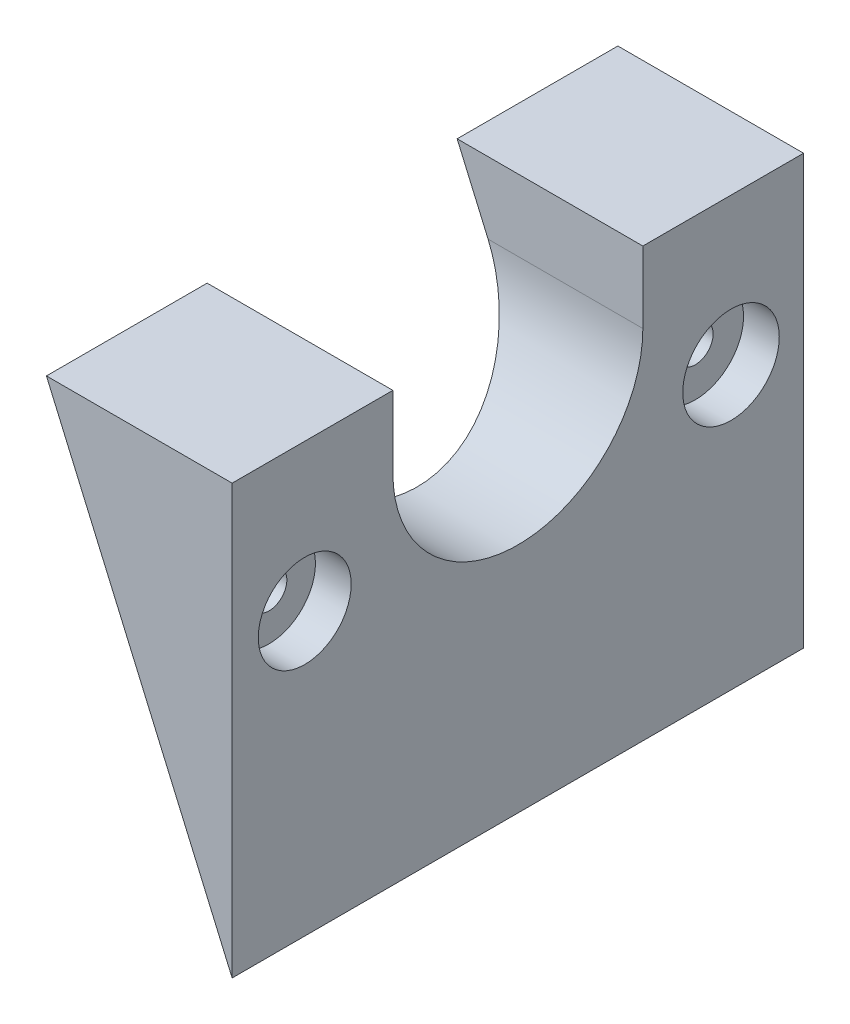
ISO-10303-21;
HEADER;
FILE_DESCRIPTION(('STEP AP214'),'2;1');
FILE_NAME('part.step','',(''),(''),'','','');
FILE_SCHEMA(('AUTOMOTIVE_DESIGN { 1 0 10303 214 1 1 1 1 }'));
ENDSEC;
DATA;
#1=APPLICATION_CONTEXT('core data for automotive mechanical design processes');
#2=APPLICATION_PROTOCOL_DEFINITION('international standard','automotive_design',2000,#1);
#3=PRODUCT_CONTEXT('',#1,'mechanical');
#4=PRODUCT('Part','Part','',(#3));
#5=PRODUCT_RELATED_PRODUCT_CATEGORY('part','',(#4));
#6=PRODUCT_DEFINITION_FORMATION('','',#4);
#7=PRODUCT_DEFINITION_CONTEXT('part definition',#1,'design');
#8=PRODUCT_DEFINITION('design','',#6,#7);
#9=PRODUCT_DEFINITION_SHAPE('','',#8);
#10=(LENGTH_UNIT() NAMED_UNIT(*) SI_UNIT(.MILLI.,.METRE.));
#11=(NAMED_UNIT(*) PLANE_ANGLE_UNIT() SI_UNIT($,.RADIAN.));
#12=(NAMED_UNIT(*) SI_UNIT($,.STERADIAN.) SOLID_ANGLE_UNIT());
#13=UNCERTAINTY_MEASURE_WITH_UNIT(LENGTH_MEASURE(1.E-05),#10,'distance_accuracy_value','');
#14=(GEOMETRIC_REPRESENTATION_CONTEXT(3) GLOBAL_UNCERTAINTY_ASSIGNED_CONTEXT((#13)) GLOBAL_UNIT_ASSIGNED_CONTEXT((#10,
#11,#12)) REPRESENTATION_CONTEXT('',''));
#15=CARTESIAN_POINT('',(0.,0.,0.));
#16=DIRECTION('',(0.,0.,1.));
#17=DIRECTION('',(1.,0.,0.));
#18=AXIS2_PLACEMENT_3D('',#15,#16,#17);
#19=CARTESIAN_POINT('',(-80.,39.4294929719621,10.1582088850458));
#20=DIRECTION('',(1.,0.,0.));
#21=DIRECTION('',(0.,0.,-1.));
#22=AXIS2_PLACEMENT_3D('',#19,#20,#21);
#23=CYLINDRICAL_SURFACE('',#22,2.5);
#24=CARTESIAN_POINT('',(-17.0861136211836,39.4294929719621,10.1582088850458));
#25=DIRECTION('',(0.917555625309924,0.397607437634301,0.));
#26=DIRECTION('',(0.3976074376343,-0.917555625309924,0.));
#27=AXIS2_PLACEMENT_3D('',#24,#25,#26);
#28=ELLIPSE('',#27,2.7246304540453,2.5);
#29=CARTESIAN_POINT('',(-16.0027802878502,36.9294929719621,10.1582088850458));
#30=VERTEX_POINT('',#29);
#31=EDGE_CURVE('E131',#30,#30,#28,.T.);
#32=ORIENTED_EDGE('',*,*,#31,.F.);
#33=EDGE_LOOP('',(#32));
#34=FACE_BOUND('',#33,.T.);
#35=CARTESIAN_POINT('',(-5.,39.4294929719621,10.1582088850458));
#36=DIRECTION('',(1.,0.,0.));
#37=DIRECTION('',(0.,0.,-1.));
#38=AXIS2_PLACEMENT_3D('',#35,#36,#37);
#39=CIRCLE('',#38,2.5);
#40=CARTESIAN_POINT('',(-5.,39.4294929719621,7.65820888504579));
#41=VERTEX_POINT('',#40);
#42=EDGE_CURVE('E37',#41,#41,#39,.F.);
#43=ORIENTED_EDGE('',*,*,#42,.F.);
#44=EDGE_LOOP('',(#43));
#45=FACE_BOUND('',#44,.T.);
#46=ADVANCED_FACE('F33',(#34,#45),#23,.F.);
#47=CARTESIAN_POINT('',(-80.,39.4294929719621,69.8417911149542));
#48=DIRECTION('',(1.,0.,0.));
#49=DIRECTION('',(0.,0.,-1.));
#50=AXIS2_PLACEMENT_3D('',#47,#48,#49);
#51=CYLINDRICAL_SURFACE('',#50,2.5);
#52=CARTESIAN_POINT('',(-17.0861136211836,39.4294929719621,69.8417911149542));
#53=DIRECTION('',(0.917555625309924,0.397607437634301,0.));
#54=DIRECTION('',(0.3976074376343,-0.917555625309924,0.));
#55=AXIS2_PLACEMENT_3D('',#52,#53,#54);
#56=ELLIPSE('',#55,2.7246304540453,2.5);
#57=CARTESIAN_POINT('',(-16.0027802878502,36.9294929719621,69.8417911149542));
#58=VERTEX_POINT('',#57);
#59=EDGE_CURVE('E136',#58,#58,#56,.T.);
#60=ORIENTED_EDGE('',*,*,#59,.F.);
#61=EDGE_LOOP('',(#60));
#62=FACE_BOUND('',#61,.T.);
#63=CARTESIAN_POINT('',(-5.,39.4294929719621,69.8417911149542));
#64=DIRECTION('',(1.,0.,0.));
#65=DIRECTION('',(0.,0.,-1.));
#66=AXIS2_PLACEMENT_3D('',#63,#64,#65);
#67=CIRCLE('',#66,2.5);
#68=CARTESIAN_POINT('',(-5.,39.4294929719621,67.3417911149542));
#69=VERTEX_POINT('',#68);
#70=EDGE_CURVE('E129',#69,#69,#67,.F.);
#71=ORIENTED_EDGE('',*,*,#70,.F.);
#72=EDGE_LOOP('',(#71));
#73=FACE_BOUND('',#72,.T.);
#74=ADVANCED_FACE('F196',(#62,#73),#51,.F.);
#75=CARTESIAN_POINT('',(0.,60.,80.));
#76=DIRECTION('',(0.,-1.,0.));
#77=DIRECTION('',(1.,0.,0.));
#78=AXIS2_PLACEMENT_3D('',#75,#76,#77);
#79=PLANE('',#78);
#80=DIRECTION('',(0.,0.,-1.));
#81=VECTOR('',#80,1.);
#82=CARTESIAN_POINT('',(0.,60.,80.));
#83=LINE('',#82,#81);
#84=CARTESIAN_POINT('',(0.,60.,80.));
#85=VERTEX_POINT('',#84);
#86=CARTESIAN_POINT('',(0.,60.,57.5));
#87=VERTEX_POINT('',#86);
#88=EDGE_CURVE('E42',#85,#87,#83,.T.);
#89=ORIENTED_EDGE('',*,*,#88,.T.);
#90=DIRECTION('',(1.,0.,0.));
#91=VECTOR('',#90,1.);
#92=CARTESIAN_POINT('',(-26.,60.,57.5));
#93=LINE('',#92,#91);
#94=CARTESIAN_POINT('',(-26.,60.,57.5));
#95=VERTEX_POINT('',#94);
#96=EDGE_CURVE('E107',#95,#87,#93,.T.);
#97=ORIENTED_EDGE('',*,*,#96,.F.);
#98=DIRECTION('',(0.,0.,-1.));
#99=VECTOR('',#98,1.);
#100=CARTESIAN_POINT('',(-26.,60.,80.));
#101=LINE('',#100,#99);
#102=CARTESIAN_POINT('',(-26.,60.,80.));
#103=VERTEX_POINT('',#102);
#104=EDGE_CURVE('E121',#103,#95,#101,.T.);
#105=ORIENTED_EDGE('',*,*,#104,.F.);
#106=DIRECTION('',(-1.,0.,0.));
#107=VECTOR('',#106,1.);
#108=CARTESIAN_POINT('',(0.,60.,80.));
#109=LINE('',#108,#107);
#110=EDGE_CURVE('E59',#85,#103,#109,.T.);
#111=ORIENTED_EDGE('',*,*,#110,.F.);
#112=EDGE_LOOP('',(#89,#97,#105,#111));
#113=FACE_BOUND('',#112,.T.);
#114=ADVANCED_FACE('F179',(#113),#79,.F.);
#115=CARTESIAN_POINT('',(-26.,60.,80.));
#116=DIRECTION('',(0.917555625309924,0.397607437634301,0.));
#117=DIRECTION('',(-0.3976074376343,0.917555625309924,0.));
#118=AXIS2_PLACEMENT_3D('',#115,#116,#117);
#119=PLANE('',#118);
#120=ORIENTED_EDGE('',*,*,#31,.T.);
#121=EDGE_LOOP('',(#120));
#122=FACE_BOUND('',#121,.T.);
#123=ORIENTED_EDGE('',*,*,#59,.T.);
#124=EDGE_LOOP('',(#123));
#125=FACE_BOUND('',#124,.T.);
#126=ORIENTED_EDGE('',*,*,#104,.T.);
#127=DIRECTION('',(0.3976074376343,-0.917555625309924,0.));
#128=VECTOR('',#127,1.);
#129=CARTESIAN_POINT('',(-26.,60.,57.5));
#130=LINE('',#129,#128);
#131=CARTESIAN_POINT('',(-21.6666666666667,50.,57.5));
#132=VERTEX_POINT('',#131);
#133=EDGE_CURVE('E114',#95,#132,#130,.T.);
#134=ORIENTED_EDGE('',*,*,#133,.T.);
#135=CARTESIAN_POINT('',(-21.6666666666667,50.,40.));
#136=DIRECTION('',(0.917555625309924,0.397607437634301,0.));
#137=DIRECTION('',(0.3976074376343,-0.917555625309924,0.));
#138=AXIS2_PLACEMENT_3D('',#135,#136,#137);
#139=ELLIPSE('',#138,19.0724131783171,17.5);
#140=CARTESIAN_POINT('',(-21.6666666666667,50.,22.5));
#141=VERTEX_POINT('',#140);
#142=EDGE_CURVE('E113',#132,#141,#139,.T.);
#143=ORIENTED_EDGE('',*,*,#142,.T.);
#144=DIRECTION('',(-0.3976074376343,0.917555625309924,0.));
#145=VECTOR('',#144,1.);
#146=CARTESIAN_POINT('',(-26.,60.,22.5));
#147=LINE('',#146,#145);
#148=CARTESIAN_POINT('',(-26.,60.,22.5));
#149=VERTEX_POINT('',#148);
#150=EDGE_CURVE('E103',#141,#149,#147,.T.);
#151=ORIENTED_EDGE('',*,*,#150,.T.);
#152=CARTESIAN_POINT('',(-26.,60.,0.));
#153=VERTEX_POINT('',#152);
#154=EDGE_CURVE('E77',#149,#153,#101,.T.);
#155=ORIENTED_EDGE('',*,*,#154,.T.);
#156=DIRECTION('',(0.397607437634301,-0.917555625309924,0.));
#157=VECTOR('',#156,1.);
#158=CARTESIAN_POINT('',(-26.,60.,0.));
#159=LINE('',#158,#157);
#160=CARTESIAN_POINT('',(0.,0.,0.));
#161=VERTEX_POINT('',#160);
#162=EDGE_CURVE('E163',#153,#161,#159,.T.);
#163=ORIENTED_EDGE('',*,*,#162,.T.);
#164=DIRECTION('',(0.,0.,-1.));
#165=VECTOR('',#164,1.);
#166=CARTESIAN_POINT('',(0.,0.,80.));
#167=LINE('',#166,#165);
#168=CARTESIAN_POINT('',(0.,0.,80.));
#169=VERTEX_POINT('',#168);
#170=EDGE_CURVE('E11',#169,#161,#167,.T.);
#171=ORIENTED_EDGE('',*,*,#170,.F.);
#172=DIRECTION('',(0.397607437634301,-0.917555625309924,0.));
#173=VECTOR('',#172,1.);
#174=CARTESIAN_POINT('',(-26.,60.,80.));
#175=LINE('',#174,#173);
#176=EDGE_CURVE('E164',#103,#169,#175,.T.);
#177=ORIENTED_EDGE('',*,*,#176,.F.);
#178=EDGE_LOOP('',(#126,#134,#143,#151,#155,#163,#171,#177));
#179=FACE_BOUND('',#178,.T.);
#180=ADVANCED_FACE('F35',(#122,#125,#179),#119,.F.);
#181=CARTESIAN_POINT('',(0.,0.,80.));
#182=DIRECTION('',(-1.,0.,0.));
#183=DIRECTION('',(0.,0.,1.));
#184=AXIS2_PLACEMENT_3D('',#181,#182,#183);
#185=PLANE('',#184);
#186=CARTESIAN_POINT('',(0.,39.4294929719621,10.1582088850458));
#187=DIRECTION('',(1.,0.,0.));
#188=DIRECTION('',(0.,0.,-1.));
#189=AXIS2_PLACEMENT_3D('',#186,#187,#188);
#190=CIRCLE('',#189,6.75580610171235);
#191=CARTESIAN_POINT('',(0.,39.4294929719621,3.40240278333344));
#192=VERTEX_POINT('',#191);
#193=EDGE_CURVE('E146',#192,#192,#190,.T.);
#194=ORIENTED_EDGE('',*,*,#193,.F.);
#195=EDGE_LOOP('',(#194));
#196=FACE_BOUND('',#195,.T.);
#197=CARTESIAN_POINT('',(0.,39.4294929719621,69.8417911149542));
#198=DIRECTION('',(1.,0.,0.));
#199=DIRECTION('',(0.,0.,-1.));
#200=AXIS2_PLACEMENT_3D('',#197,#198,#199);
#201=CIRCLE('',#200,6.50511993876965);
#202=CARTESIAN_POINT('',(0.,39.4294929719621,63.3366711761846));
#203=VERTEX_POINT('',#202);
#204=EDGE_CURVE('E139',#203,#203,#201,.T.);
#205=ORIENTED_EDGE('',*,*,#204,.F.);
#206=EDGE_LOOP('',(#205));
#207=FACE_BOUND('',#206,.T.);
#208=CARTESIAN_POINT('',(0.,50.,40.));
#209=DIRECTION('',(1.,0.,0.));
#210=DIRECTION('',(0.,0.,1.));
#211=AXIS2_PLACEMENT_3D('',#208,#209,#210);
#212=CIRCLE('',#211,17.5);
#213=CARTESIAN_POINT('',(0.,50.,57.5));
#214=VERTEX_POINT('',#213);
#215=CARTESIAN_POINT('',(0.,50.,22.5));
#216=VERTEX_POINT('',#215);
#217=EDGE_CURVE('E151',#214,#216,#212,.T.);
#218=ORIENTED_EDGE('',*,*,#217,.F.);
#219=DIRECTION('',(0.,-1.,0.));
#220=VECTOR('',#219,1.);
#221=CARTESIAN_POINT('',(0.,50.,57.5));
#222=LINE('',#221,#220);
#223=EDGE_CURVE('E155',#87,#214,#222,.T.);
#224=ORIENTED_EDGE('',*,*,#223,.F.);
#225=ORIENTED_EDGE('',*,*,#88,.F.);
#226=DIRECTION('',(0.,1.,0.));
#227=VECTOR('',#226,1.);
#228=CARTESIAN_POINT('',(0.,0.,80.));
#229=LINE('',#228,#227);
#230=EDGE_CURVE('E82',#169,#85,#229,.T.);
#231=ORIENTED_EDGE('',*,*,#230,.F.);
#232=ORIENTED_EDGE('',*,*,#170,.T.);
#233=DIRECTION('',(0.,1.,0.));
#234=VECTOR('',#233,1.);
#235=CARTESIAN_POINT('',(0.,0.,0.));
#236=LINE('',#235,#234);
#237=CARTESIAN_POINT('',(0.,60.,0.));
#238=VERTEX_POINT('',#237);
#239=EDGE_CURVE('E167',#161,#238,#236,.T.);
#240=ORIENTED_EDGE('',*,*,#239,.T.);
#241=CARTESIAN_POINT('',(0.,60.,22.5));
#242=VERTEX_POINT('',#241);
#243=EDGE_CURVE('E123',#242,#238,#83,.T.);
#244=ORIENTED_EDGE('',*,*,#243,.F.);
#245=DIRECTION('',(0.,1.,0.));
#246=VECTOR('',#245,1.);
#247=CARTESIAN_POINT('',(0.,60.,22.5));
#248=LINE('',#247,#246);
#249=EDGE_CURVE('E50',#216,#242,#248,.T.);
#250=ORIENTED_EDGE('',*,*,#249,.F.);
#251=EDGE_LOOP('',(#218,#224,#225,#231,#232,#240,#244,#250));
#252=FACE_BOUND('',#251,.T.);
#253=ADVANCED_FACE('F170',(#196,#207,#252),#185,.F.);
#254=ORIENTED_EDGE('',*,*,#154,.F.);
#255=DIRECTION('',(1.,0.,0.));
#256=VECTOR('',#255,1.);
#257=CARTESIAN_POINT('',(-26.,60.,22.5));
#258=LINE('',#257,#256);
#259=EDGE_CURVE('E101',#149,#242,#258,.T.);
#260=ORIENTED_EDGE('',*,*,#259,.T.);
#261=ORIENTED_EDGE('',*,*,#243,.T.);
#262=DIRECTION('',(-1.,0.,0.));
#263=VECTOR('',#262,1.);
#264=CARTESIAN_POINT('',(0.,60.,0.));
#265=LINE('',#264,#263);
#266=EDGE_CURVE('E119',#238,#153,#265,.T.);
#267=ORIENTED_EDGE('',*,*,#266,.T.);
#268=EDGE_LOOP('',(#254,#260,#261,#267));
#269=FACE_BOUND('',#268,.T.);
#270=ADVANCED_FACE('F117',(#269),#79,.F.);
#271=CARTESIAN_POINT('',(0.,0.,80.));
#272=DIRECTION('',(0.,0.,-1.));
#273=DIRECTION('',(-1.,0.,0.));
#274=AXIS2_PLACEMENT_3D('',#271,#272,#273);
#275=PLANE('',#274);
#276=ORIENTED_EDGE('',*,*,#176,.T.);
#277=ORIENTED_EDGE('',*,*,#230,.T.);
#278=ORIENTED_EDGE('',*,*,#110,.T.);
#279=EDGE_LOOP('',(#276,#277,#278));
#280=FACE_BOUND('',#279,.T.);
#281=ADVANCED_FACE('F175',(#280),#275,.F.);
#282=CARTESIAN_POINT('',(0.,0.,0.));
#283=DIRECTION('',(0.,0.,-1.));
#284=DIRECTION('',(-1.,0.,0.));
#285=AXIS2_PLACEMENT_3D('',#282,#283,#284);
#286=PLANE('',#285);
#287=ORIENTED_EDGE('',*,*,#162,.F.);
#288=ORIENTED_EDGE('',*,*,#266,.F.);
#289=ORIENTED_EDGE('',*,*,#239,.F.);
#290=EDGE_LOOP('',(#287,#288,#289));
#291=FACE_BOUND('',#290,.T.);
#292=ADVANCED_FACE('F173',(#291),#286,.T.);
#293=CARTESIAN_POINT('',(-26.,50.,40.));
#294=DIRECTION('',(1.,0.,0.));
#295=DIRECTION('',(0.,0.,-1.));
#296=AXIS2_PLACEMENT_3D('',#293,#294,#295);
#297=CYLINDRICAL_SURFACE('',#296,17.5);
#298=DIRECTION('',(1.,0.,0.));
#299=VECTOR('',#298,1.);
#300=CARTESIAN_POINT('',(-26.,50.,57.5));
#301=LINE('',#300,#299);
#302=EDGE_CURVE('E115',#132,#214,#301,.T.);
#303=ORIENTED_EDGE('',*,*,#302,.T.);
#304=ORIENTED_EDGE('',*,*,#217,.T.);
#305=DIRECTION('',(1.,0.,0.));
#306=VECTOR('',#305,1.);
#307=CARTESIAN_POINT('',(-26.,50.,22.5));
#308=LINE('',#307,#306);
#309=EDGE_CURVE('E108',#141,#216,#308,.T.);
#310=ORIENTED_EDGE('',*,*,#309,.F.);
#311=ORIENTED_EDGE('',*,*,#142,.F.);
#312=EDGE_LOOP('',(#303,#304,#310,#311));
#313=FACE_BOUND('',#312,.T.);
#314=ADVANCED_FACE('F184',(#313),#297,.F.);
#315=CARTESIAN_POINT('',(-26.,50.,57.5));
#316=DIRECTION('',(0.,0.,1.));
#317=DIRECTION('',(1.,0.,0.));
#318=AXIS2_PLACEMENT_3D('',#315,#316,#317);
#319=PLANE('',#318);
#320=ORIENTED_EDGE('',*,*,#96,.T.);
#321=ORIENTED_EDGE('',*,*,#223,.T.);
#322=ORIENTED_EDGE('',*,*,#302,.F.);
#323=ORIENTED_EDGE('',*,*,#133,.F.);
#324=EDGE_LOOP('',(#320,#321,#322,#323));
#325=FACE_BOUND('',#324,.T.);
#326=ADVANCED_FACE('F181',(#325),#319,.F.);
#327=CARTESIAN_POINT('',(-26.,60.,22.5));
#328=DIRECTION('',(0.,0.,-1.));
#329=DIRECTION('',(0.,1.,0.));
#330=AXIS2_PLACEMENT_3D('',#327,#328,#329);
#331=PLANE('',#330);
#332=ORIENTED_EDGE('',*,*,#309,.T.);
#333=ORIENTED_EDGE('',*,*,#249,.T.);
#334=ORIENTED_EDGE('',*,*,#259,.F.);
#335=ORIENTED_EDGE('',*,*,#150,.F.);
#336=EDGE_LOOP('',(#332,#333,#334,#335));
#337=FACE_BOUND('',#336,.T.);
#338=ADVANCED_FACE('F102',(#337),#331,.F.);
#339=CARTESIAN_POINT('',(-5.,39.4294929719621,69.8417911149542));
#340=DIRECTION('',(1.,0.,0.));
#341=DIRECTION('',(0.,0.,-1.));
#342=AXIS2_PLACEMENT_3D('',#339,#340,#341);
#343=PLANE('',#342);
#344=CARTESIAN_POINT('',(-5.,39.4294929719621,69.8417911149542));
#345=DIRECTION('',(1.,0.,0.));
#346=DIRECTION('',(0.,0.,-1.));
#347=AXIS2_PLACEMENT_3D('',#344,#345,#346);
#348=CIRCLE('',#347,6.50511993876965);
#349=CARTESIAN_POINT('',(-5.,39.4294929719621,63.3366711761846));
#350=VERTEX_POINT('',#349);
#351=EDGE_CURVE('E132',#350,#350,#348,.T.);
#352=ORIENTED_EDGE('',*,*,#351,.T.);
#353=EDGE_LOOP('',(#352));
#354=FACE_BOUND('',#353,.T.);
#355=ORIENTED_EDGE('',*,*,#70,.T.);
#356=EDGE_LOOP('',(#355));
#357=FACE_BOUND('',#356,.T.);
#358=ADVANCED_FACE('F211',(#354,#357),#343,.T.);
#359=CARTESIAN_POINT('',(-5.,39.4294929719621,69.8417911149542));
#360=DIRECTION('',(1.,0.,0.));
#361=DIRECTION('',(0.,0.,-1.));
#362=AXIS2_PLACEMENT_3D('',#359,#360,#361);
#363=CYLINDRICAL_SURFACE('',#362,6.50511993876965);
#364=ORIENTED_EDGE('',*,*,#351,.F.);
#365=EDGE_LOOP('',(#364));
#366=FACE_BOUND('',#365,.T.);
#367=ORIENTED_EDGE('',*,*,#204,.T.);
#368=EDGE_LOOP('',(#367));
#369=FACE_BOUND('',#368,.T.);
#370=ADVANCED_FACE('F208',(#366,#369),#363,.F.);
#371=CARTESIAN_POINT('',(-5.,39.4294929719621,10.1582088850458));
#372=DIRECTION('',(1.,0.,0.));
#373=DIRECTION('',(0.,0.,-1.));
#374=AXIS2_PLACEMENT_3D('',#371,#372,#373);
#375=PLANE('',#374);
#376=CARTESIAN_POINT('',(-5.,39.4294929719621,10.1582088850458));
#377=DIRECTION('',(1.,0.,0.));
#378=DIRECTION('',(0.,0.,-1.));
#379=AXIS2_PLACEMENT_3D('',#376,#377,#378);
#380=CIRCLE('',#379,6.75580610171235);
#381=CARTESIAN_POINT('',(-5.,39.4294929719621,3.40240278333344));
#382=VERTEX_POINT('',#381);
#383=EDGE_CURVE('E234',#382,#382,#380,.T.);
#384=ORIENTED_EDGE('',*,*,#383,.T.);
#385=EDGE_LOOP('',(#384));
#386=FACE_BOUND('',#385,.T.);
#387=ORIENTED_EDGE('',*,*,#42,.T.);
#388=EDGE_LOOP('',(#387));
#389=FACE_BOUND('',#388,.T.);
#390=ADVANCED_FACE('F220',(#386,#389),#375,.T.);
#391=CARTESIAN_POINT('',(-5.,39.4294929719621,10.1582088850458));
#392=DIRECTION('',(1.,0.,0.));
#393=DIRECTION('',(0.,0.,-1.));
#394=AXIS2_PLACEMENT_3D('',#391,#392,#393);
#395=CYLINDRICAL_SURFACE('',#394,6.75580610171235);
#396=ORIENTED_EDGE('',*,*,#383,.F.);
#397=EDGE_LOOP('',(#396));
#398=FACE_BOUND('',#397,.T.);
#399=ORIENTED_EDGE('',*,*,#193,.T.);
#400=EDGE_LOOP('',(#399));
#401=FACE_BOUND('',#400,.T.);
#402=ADVANCED_FACE('F223',(#398,#401),#395,.F.);
#403=CLOSED_SHELL('',(#46,#74,#114,#180,#253,#270,#281,#292,#314,#326,#338,#358,#370,#390,#402));
#404=MANIFOLD_SOLID_BREP('B2',#403);
#405=ADVANCED_BREP_SHAPE_REPRESENTATION('',(#18,#404),#14);
#406=SHAPE_DEFINITION_REPRESENTATION(#9,#405);
ENDSEC;
END-ISO-10303-21;
